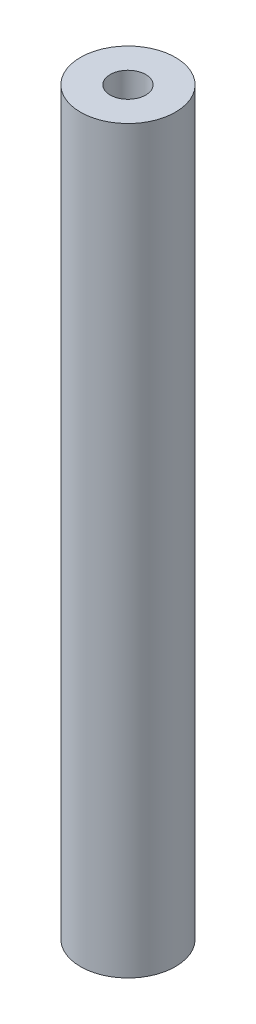
ISO-10303-21;
HEADER;
FILE_DESCRIPTION(('STEP AP214'),'2;1');
FILE_NAME('part.step','',(''),(''),'','','');
FILE_SCHEMA(('AUTOMOTIVE_DESIGN { 1 0 10303 214 1 1 1 1 }'));
ENDSEC;
DATA;
#1=APPLICATION_CONTEXT('core data for automotive mechanical design processes');
#2=APPLICATION_PROTOCOL_DEFINITION('international standard','automotive_design',2000,#1);
#3=PRODUCT_CONTEXT('',#1,'mechanical');
#4=PRODUCT('Part','Part','',(#3));
#5=PRODUCT_RELATED_PRODUCT_CATEGORY('part','',(#4));
#6=PRODUCT_DEFINITION_FORMATION('','',#4);
#7=PRODUCT_DEFINITION_CONTEXT('part definition',#1,'design');
#8=PRODUCT_DEFINITION('design','',#6,#7);
#9=PRODUCT_DEFINITION_SHAPE('','',#8);
#10=(LENGTH_UNIT() NAMED_UNIT(*) SI_UNIT(.MILLI.,.METRE.));
#11=(NAMED_UNIT(*) PLANE_ANGLE_UNIT() SI_UNIT($,.RADIAN.));
#12=(NAMED_UNIT(*) SI_UNIT($,.STERADIAN.) SOLID_ANGLE_UNIT());
#13=UNCERTAINTY_MEASURE_WITH_UNIT(LENGTH_MEASURE(1.E-05),#10,'distance_accuracy_value','');
#14=(GEOMETRIC_REPRESENTATION_CONTEXT(3) GLOBAL_UNCERTAINTY_ASSIGNED_CONTEXT((#13)) GLOBAL_UNIT_ASSIGNED_CONTEXT((#10,
#11,#12)) REPRESENTATION_CONTEXT('',''));
#15=CARTESIAN_POINT('',(0.,0.,0.));
#16=DIRECTION('',(0.,0.,1.));
#17=DIRECTION('',(1.,0.,0.));
#18=AXIS2_PLACEMENT_3D('',#15,#16,#17);
#19=CARTESIAN_POINT('',(0.,46.75,250.));
#20=DIRECTION('',(0.,1.,0.));
#21=DIRECTION('',(0.,0.,1.));
#22=AXIS2_PLACEMENT_3D('',#19,#20,#21);
#23=PLANE('',#22);
#24=CARTESIAN_POINT('',(0.,46.75,250.));
#25=DIRECTION('',(0.,1.,0.));
#26=DIRECTION('',(0.,0.,1.));
#27=AXIS2_PLACEMENT_3D('',#24,#25,#26);
#28=CIRCLE('',#27,6.);
#29=CARTESIAN_POINT('',(0.,46.75,256.));
#30=VERTEX_POINT('',#29);
#31=EDGE_CURVE('E10',#30,#30,#28,.T.);
#32=ORIENTED_EDGE('',*,*,#31,.T.);
#33=EDGE_LOOP('',(#32));
#34=FACE_BOUND('',#33,.T.);
#35=CARTESIAN_POINT('',(0.,46.75,250.));
#36=DIRECTION('',(0.,1.,0.));
#37=DIRECTION('',(0.,0.,1.));
#38=AXIS2_PLACEMENT_3D('',#35,#36,#37);
#39=CIRCLE('',#38,2.25);
#40=CARTESIAN_POINT('',(0.,46.75,252.25));
#41=VERTEX_POINT('',#40);
#42=EDGE_CURVE('E54',#41,#41,#39,.T.);
#43=ORIENTED_EDGE('',*,*,#42,.F.);
#44=EDGE_LOOP('',(#43));
#45=FACE_BOUND('',#44,.T.);
#46=ADVANCED_FACE('F41',(#34,#45),#23,.T.);
#47=CARTESIAN_POINT('',(0.,-46.75,250.));
#48=DIRECTION('',(0.,1.,0.));
#49=DIRECTION('',(0.,0.,1.));
#50=AXIS2_PLACEMENT_3D('',#47,#48,#49);
#51=PLANE('',#50);
#52=CARTESIAN_POINT('',(0.,-46.75,250.));
#53=DIRECTION('',(0.,1.,0.));
#54=DIRECTION('',(0.,0.,1.));
#55=AXIS2_PLACEMENT_3D('',#52,#53,#54);
#56=CIRCLE('',#55,6.);
#57=CARTESIAN_POINT('',(0.,-46.75,256.));
#58=VERTEX_POINT('',#57);
#59=EDGE_CURVE('E44',#58,#58,#56,.T.);
#60=ORIENTED_EDGE('',*,*,#59,.F.);
#61=EDGE_LOOP('',(#60));
#62=FACE_BOUND('',#61,.T.);
#63=CARTESIAN_POINT('',(0.,-46.75,250.));
#64=DIRECTION('',(0.,1.,0.));
#65=DIRECTION('',(0.,0.,1.));
#66=AXIS2_PLACEMENT_3D('',#63,#64,#65);
#67=CIRCLE('',#66,2.25);
#68=CARTESIAN_POINT('',(0.,-46.75,252.25));
#69=VERTEX_POINT('',#68);
#70=EDGE_CURVE('E60',#69,#69,#67,.T.);
#71=ORIENTED_EDGE('',*,*,#70,.T.);
#72=EDGE_LOOP('',(#71));
#73=FACE_BOUND('',#72,.T.);
#74=ADVANCED_FACE('F69',(#62,#73),#51,.F.);
#75=CARTESIAN_POINT('',(0.,46.75,250.));
#76=DIRECTION('',(0.,-1.,0.));
#77=DIRECTION('',(0.,0.,-1.));
#78=AXIS2_PLACEMENT_3D('',#75,#76,#77);
#79=CYLINDRICAL_SURFACE('',#78,6.);
#80=ORIENTED_EDGE('',*,*,#31,.F.);
#81=EDGE_LOOP('',(#80));
#82=FACE_BOUND('',#81,.T.);
#83=ORIENTED_EDGE('',*,*,#59,.T.);
#84=EDGE_LOOP('',(#83));
#85=FACE_BOUND('',#84,.T.);
#86=ADVANCED_FACE('F43',(#82,#85),#79,.T.);
#87=CARTESIAN_POINT('',(0.,46.75,250.));
#88=DIRECTION('',(0.,-1.,0.));
#89=DIRECTION('',(0.,0.,-1.));
#90=AXIS2_PLACEMENT_3D('',#87,#88,#89);
#91=CYLINDRICAL_SURFACE('',#90,2.25);
#92=ORIENTED_EDGE('',*,*,#42,.T.);
#93=EDGE_LOOP('',(#92));
#94=FACE_BOUND('',#93,.T.);
#95=ORIENTED_EDGE('',*,*,#70,.F.);
#96=EDGE_LOOP('',(#95));
#97=FACE_BOUND('',#96,.T.);
#98=ADVANCED_FACE('F61',(#94,#97),#91,.F.);
#99=CLOSED_SHELL('',(#46,#74,#86,#98));
#100=MANIFOLD_SOLID_BREP('B2',#99);
#101=ADVANCED_BREP_SHAPE_REPRESENTATION('',(#18,#100),#14);
#102=SHAPE_DEFINITION_REPRESENTATION(#9,#101);
ENDSEC;
END-ISO-10303-21;
